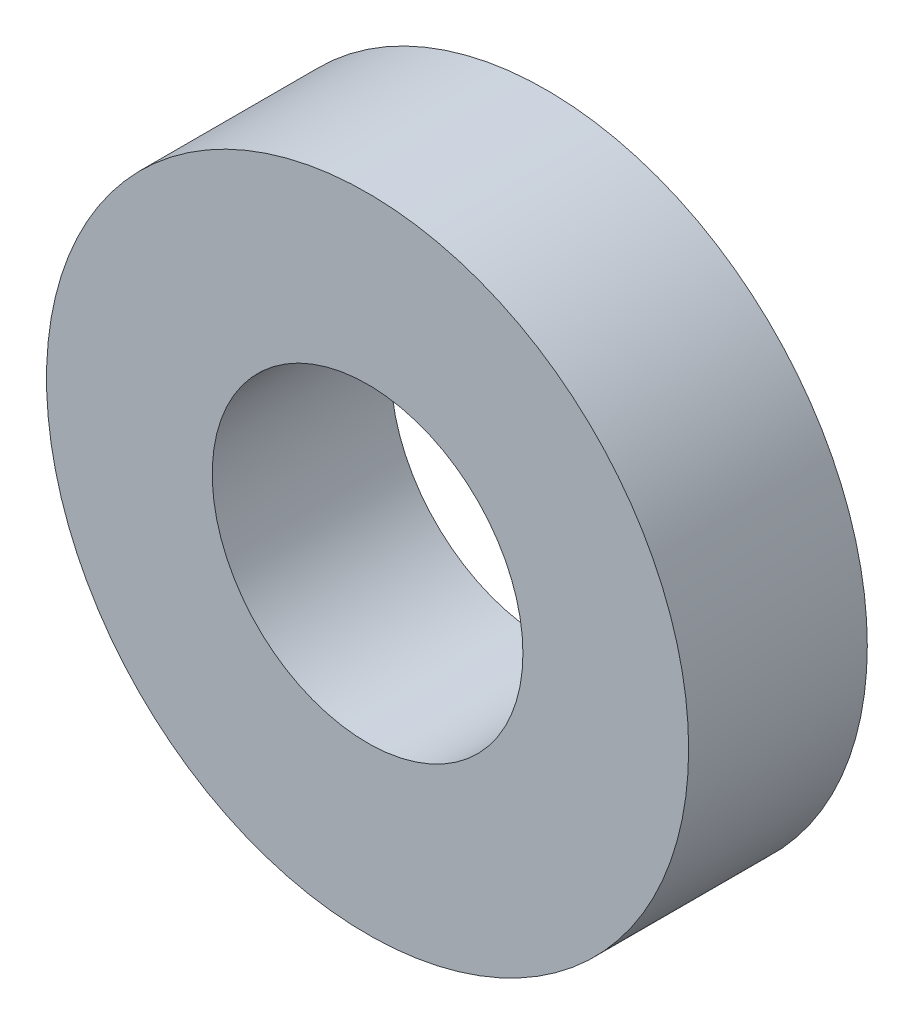
ISO-10303-21;
HEADER;
FILE_DESCRIPTION(('STEP AP214'),'2;1');
FILE_NAME('part.step','',(''),(''),'','','');
FILE_SCHEMA(('AUTOMOTIVE_DESIGN { 1 0 10303 214 1 1 1 1 }'));
ENDSEC;
DATA;
#1=APPLICATION_CONTEXT('core data for automotive mechanical design processes');
#2=APPLICATION_PROTOCOL_DEFINITION('international standard','automotive_design',2000,#1);
#3=PRODUCT_CONTEXT('',#1,'mechanical');
#4=PRODUCT('Part','Part','',(#3));
#5=PRODUCT_RELATED_PRODUCT_CATEGORY('part','',(#4));
#6=PRODUCT_DEFINITION_FORMATION('','',#4);
#7=PRODUCT_DEFINITION_CONTEXT('part definition',#1,'design');
#8=PRODUCT_DEFINITION('design','',#6,#7);
#9=PRODUCT_DEFINITION_SHAPE('','',#8);
#10=(LENGTH_UNIT() NAMED_UNIT(*) SI_UNIT(.MILLI.,.METRE.));
#11=(NAMED_UNIT(*) PLANE_ANGLE_UNIT() SI_UNIT($,.RADIAN.));
#12=(NAMED_UNIT(*) SI_UNIT($,.STERADIAN.) SOLID_ANGLE_UNIT());
#13=UNCERTAINTY_MEASURE_WITH_UNIT(LENGTH_MEASURE(1.E-05),#10,'distance_accuracy_value','');
#14=(GEOMETRIC_REPRESENTATION_CONTEXT(3) GLOBAL_UNCERTAINTY_ASSIGNED_CONTEXT((#13)) GLOBAL_UNIT_ASSIGNED_CONTEXT((#10,
#11,#12)) REPRESENTATION_CONTEXT('',''));
#15=CARTESIAN_POINT('',(0.,0.,0.));
#16=DIRECTION('',(0.,0.,1.));
#17=DIRECTION('',(1.,0.,0.));
#18=AXIS2_PLACEMENT_3D('',#15,#16,#17);
#19=CARTESIAN_POINT('',(0.,0.,17.25));
#20=DIRECTION('',(0.,0.,1.));
#21=DIRECTION('',(1.,0.,0.));
#22=AXIS2_PLACEMENT_3D('',#19,#20,#21);
#23=PLANE('',#22);
#24=CARTESIAN_POINT('',(0.,0.,17.25));
#25=DIRECTION('',(0.,0.,1.));
#26=DIRECTION('',(1.,0.,0.));
#27=AXIS2_PLACEMENT_3D('',#24,#25,#26);
#28=CIRCLE('',#27,31.);
#29=CARTESIAN_POINT('',(31.,0.,17.25));
#30=VERTEX_POINT('',#29);
#31=EDGE_CURVE('E10',#30,#30,#28,.T.);
#32=ORIENTED_EDGE('',*,*,#31,.T.);
#33=EDGE_LOOP('',(#32));
#34=FACE_BOUND('',#33,.T.);
#35=CARTESIAN_POINT('',(0.,0.,17.25));
#36=DIRECTION('',(0.,0.,1.));
#37=DIRECTION('',(1.,0.,0.));
#38=AXIS2_PLACEMENT_3D('',#35,#36,#37);
#39=CIRCLE('',#38,15.);
#40=CARTESIAN_POINT('',(15.,0.,17.25));
#41=VERTEX_POINT('',#40);
#42=EDGE_CURVE('E46',#41,#41,#39,.T.);
#43=ORIENTED_EDGE('',*,*,#42,.F.);
#44=EDGE_LOOP('',(#43));
#45=FACE_BOUND('',#44,.T.);
#46=ADVANCED_FACE('F35',(#34,#45),#23,.T.);
#47=CARTESIAN_POINT('',(0.,0.,0.));
#48=DIRECTION('',(0.,0.,1.));
#49=DIRECTION('',(1.,0.,0.));
#50=AXIS2_PLACEMENT_3D('',#47,#48,#49);
#51=PLANE('',#50);
#52=CARTESIAN_POINT('',(0.,0.,0.));
#53=DIRECTION('',(0.,0.,1.));
#54=DIRECTION('',(1.,0.,0.));
#55=AXIS2_PLACEMENT_3D('',#52,#53,#54);
#56=CIRCLE('',#55,31.);
#57=CARTESIAN_POINT('',(31.,0.,0.));
#58=VERTEX_POINT('',#57);
#59=EDGE_CURVE('E39',#58,#58,#56,.T.);
#60=ORIENTED_EDGE('',*,*,#59,.F.);
#61=EDGE_LOOP('',(#60));
#62=FACE_BOUND('',#61,.T.);
#63=CARTESIAN_POINT('',(0.,0.,0.));
#64=DIRECTION('',(0.,0.,1.));
#65=DIRECTION('',(1.,0.,0.));
#66=AXIS2_PLACEMENT_3D('',#63,#64,#65);
#67=CIRCLE('',#66,15.);
#68=CARTESIAN_POINT('',(15.,0.,0.));
#69=VERTEX_POINT('',#68);
#70=EDGE_CURVE('E48',#69,#69,#67,.T.);
#71=ORIENTED_EDGE('',*,*,#70,.T.);
#72=EDGE_LOOP('',(#71));
#73=FACE_BOUND('',#72,.T.);
#74=ADVANCED_FACE('F58',(#62,#73),#51,.F.);
#75=CARTESIAN_POINT('',(0.,0.,17.25));
#76=DIRECTION('',(0.,0.,-1.));
#77=DIRECTION('',(-1.,0.,0.));
#78=AXIS2_PLACEMENT_3D('',#75,#76,#77);
#79=CYLINDRICAL_SURFACE('',#78,31.);
#80=ORIENTED_EDGE('',*,*,#31,.F.);
#81=EDGE_LOOP('',(#80));
#82=FACE_BOUND('',#81,.T.);
#83=ORIENTED_EDGE('',*,*,#59,.T.);
#84=EDGE_LOOP('',(#83));
#85=FACE_BOUND('',#84,.T.);
#86=ADVANCED_FACE('F37',(#82,#85),#79,.T.);
#87=CARTESIAN_POINT('',(0.,0.,17.25));
#88=DIRECTION('',(0.,0.,-1.));
#89=DIRECTION('',(-1.,0.,0.));
#90=AXIS2_PLACEMENT_3D('',#87,#88,#89);
#91=CYLINDRICAL_SURFACE('',#90,15.);
#92=ORIENTED_EDGE('',*,*,#42,.T.);
#93=EDGE_LOOP('',(#92));
#94=FACE_BOUND('',#93,.T.);
#95=ORIENTED_EDGE('',*,*,#70,.F.);
#96=EDGE_LOOP('',(#95));
#97=FACE_BOUND('',#96,.T.);
#98=ADVANCED_FACE('F54',(#94,#97),#91,.F.);
#99=CLOSED_SHELL('',(#46,#74,#86,#98));
#100=MANIFOLD_SOLID_BREP('B2',#99);
#101=ADVANCED_BREP_SHAPE_REPRESENTATION('',(#18,#100),#14);
#102=SHAPE_DEFINITION_REPRESENTATION(#9,#101);
ENDSEC;
END-ISO-10303-21;
